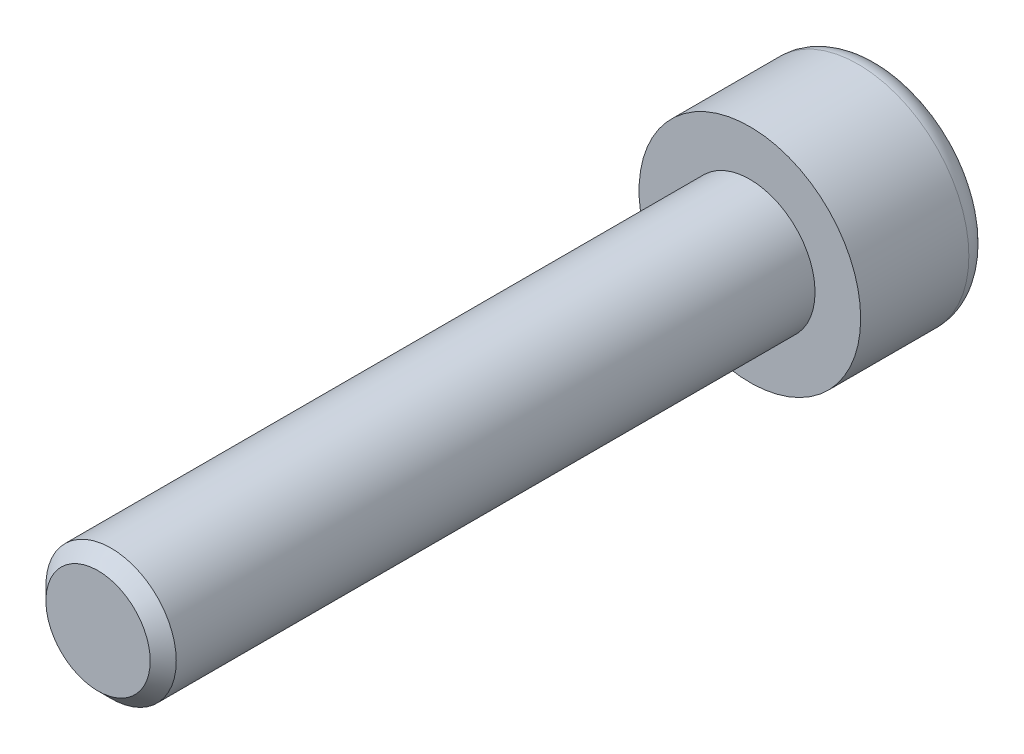
ISO-10303-21;
HEADER;
FILE_DESCRIPTION(('STEP AP214'),'2;1');
FILE_NAME('part.step','',(''),(''),'','','');
FILE_SCHEMA(('AUTOMOTIVE_DESIGN { 1 0 10303 214 1 1 1 1 }'));
ENDSEC;
DATA;
#1=APPLICATION_CONTEXT('core data for automotive mechanical design processes');
#2=APPLICATION_PROTOCOL_DEFINITION('international standard','automotive_design',2000,#1);
#3=PRODUCT_CONTEXT('',#1,'mechanical');
#4=PRODUCT('Part','Part','',(#3));
#5=PRODUCT_RELATED_PRODUCT_CATEGORY('part','',(#4));
#6=PRODUCT_DEFINITION_FORMATION('','',#4);
#7=PRODUCT_DEFINITION_CONTEXT('part definition',#1,'design');
#8=PRODUCT_DEFINITION('design','',#6,#7);
#9=PRODUCT_DEFINITION_SHAPE('','',#8);
#10=(LENGTH_UNIT() NAMED_UNIT(*) SI_UNIT(.MILLI.,.METRE.));
#11=(NAMED_UNIT(*) PLANE_ANGLE_UNIT() SI_UNIT($,.RADIAN.));
#12=(NAMED_UNIT(*) SI_UNIT($,.STERADIAN.) SOLID_ANGLE_UNIT());
#13=UNCERTAINTY_MEASURE_WITH_UNIT(LENGTH_MEASURE(1.E-05),#10,'distance_accuracy_value','');
#14=(GEOMETRIC_REPRESENTATION_CONTEXT(3) GLOBAL_UNCERTAINTY_ASSIGNED_CONTEXT((#13)) GLOBAL_UNIT_ASSIGNED_CONTEXT((#10,
#11,#12)) REPRESENTATION_CONTEXT('',''));
#15=CARTESIAN_POINT('',(0.,0.,0.));
#16=DIRECTION('',(0.,0.,1.));
#17=DIRECTION('',(1.,0.,0.));
#18=AXIS2_PLACEMENT_3D('',#15,#16,#17);
#19=CARTESIAN_POINT('',(0.,0.,25.));
#20=DIRECTION('',(0.,0.,-1.));
#21=DIRECTION('',(1.,0.,0.));
#22=AXIS2_PLACEMENT_3D('',#19,#20,#21);
#23=PLANE('',#22);
#24=CARTESIAN_POINT('',(0.,0.,25.));
#25=DIRECTION('',(0.,0.,1.));
#26=DIRECTION('',(1.,0.,0.));
#27=AXIS2_PLACEMENT_3D('',#24,#25,#26);
#28=CIRCLE('',#27,2.);
#29=CARTESIAN_POINT('',(2.,0.,25.));
#30=VERTEX_POINT('',#29);
#31=EDGE_CURVE('E11',#30,#30,#28,.T.);
#32=ORIENTED_EDGE('',*,*,#31,.T.);
#33=EDGE_LOOP('',(#32));
#34=FACE_BOUND('',#33,.T.);
#35=ADVANCED_FACE('F41',(#34),#23,.F.);
#36=CARTESIAN_POINT('',(0.,0.,25.));
#37=DIRECTION('',(0.,0.,-1.));
#38=DIRECTION('',(1.,0.,0.));
#39=AXIS2_PLACEMENT_3D('',#36,#37,#38);
#40=CONICAL_SURFACE('',#39,2.,0.785398163404999);
#41=ORIENTED_EDGE('',*,*,#31,.F.);
#42=DIRECTION('',(0.707106781192048,0.,-0.707106781181048));
#43=VECTOR('',#42,1.);
#44=CARTESIAN_POINT('',(2.,0.,25.));
#45=LINE('',#44,#43);
#46=CARTESIAN_POINT('',(2.5,0.,24.5));
#47=VERTEX_POINT('',#46);
#48=EDGE_CURVE('E52',#30,#47,#45,.T.);
#49=ORIENTED_EDGE('',*,*,#48,.T.);
#50=CARTESIAN_POINT('',(0.,0.,24.5));
#51=DIRECTION('',(0.,0.,1.));
#52=DIRECTION('',(1.,0.,0.));
#53=AXIS2_PLACEMENT_3D('',#50,#51,#52);
#54=CIRCLE('',#53,2.5);
#55=EDGE_CURVE('E211',#47,#47,#54,.T.);
#56=ORIENTED_EDGE('',*,*,#55,.T.);
#57=ORIENTED_EDGE('',*,*,#48,.F.);
#58=EDGE_LOOP('',(#41,#49,#56,#57));
#59=FACE_BOUND('',#58,.T.);
#60=ADVANCED_FACE('F257',(#59),#40,.T.);
#61=CARTESIAN_POINT('',(0.,0.,24.5));
#62=DIRECTION('',(0.,0.,-1.));
#63=DIRECTION('',(1.,0.,0.));
#64=AXIS2_PLACEMENT_3D('',#61,#62,#63);
#65=CYLINDRICAL_SURFACE('',#64,2.5);
#66=ORIENTED_EDGE('',*,*,#55,.F.);
#67=DIRECTION('',(0.,0.,-1.));
#68=VECTOR('',#67,1.);
#69=CARTESIAN_POINT('',(2.5,0.,24.5));
#70=LINE('',#69,#68);
#71=CARTESIAN_POINT('',(2.5,0.,0.));
#72=VERTEX_POINT('',#71);
#73=EDGE_CURVE('E301',#47,#72,#70,.T.);
#74=ORIENTED_EDGE('',*,*,#73,.T.);
#75=CARTESIAN_POINT('',(0.,0.,0.));
#76=DIRECTION('',(0.,0.,1.));
#77=DIRECTION('',(1.,0.,0.));
#78=AXIS2_PLACEMENT_3D('',#75,#76,#77);
#79=CIRCLE('',#78,2.5);
#80=EDGE_CURVE('E184',#72,#72,#79,.T.);
#81=ORIENTED_EDGE('',*,*,#80,.T.);
#82=ORIENTED_EDGE('',*,*,#73,.F.);
#83=EDGE_LOOP('',(#66,#74,#81,#82));
#84=FACE_BOUND('',#83,.T.);
#85=ADVANCED_FACE('F249',(#84),#65,.T.);
#86=CARTESIAN_POINT('',(0.,0.,0.));
#87=DIRECTION('',(0.,0.,-1.));
#88=DIRECTION('',(1.,0.,0.));
#89=AXIS2_PLACEMENT_3D('',#86,#87,#88);
#90=PLANE('',#89);
#91=ORIENTED_EDGE('',*,*,#80,.F.);
#92=EDGE_LOOP('',(#91));
#93=FACE_BOUND('',#92,.T.);
#94=CARTESIAN_POINT('',(0.,0.,0.));
#95=DIRECTION('',(0.,0.,1.));
#96=DIRECTION('',(1.,0.,0.));
#97=AXIS2_PLACEMENT_3D('',#94,#95,#96);
#98=CIRCLE('',#97,4.25);
#99=CARTESIAN_POINT('',(4.25,0.,0.));
#100=VERTEX_POINT('',#99);
#101=EDGE_CURVE('E180',#100,#100,#98,.T.);
#102=ORIENTED_EDGE('',*,*,#101,.T.);
#103=EDGE_LOOP('',(#102));
#104=FACE_BOUND('',#103,.T.);
#105=ADVANCED_FACE('F247',(#93,#104),#90,.F.);
#106=CARTESIAN_POINT('',(0.,0.,0.));
#107=DIRECTION('',(0.,0.,-1.));
#108=DIRECTION('',(1.,0.,0.));
#109=AXIS2_PLACEMENT_3D('',#106,#107,#108);
#110=CYLINDRICAL_SURFACE('',#109,4.25);
#111=ORIENTED_EDGE('',*,*,#101,.F.);
#112=DIRECTION('',(0.,0.,-1.));
#113=VECTOR('',#112,1.);
#114=CARTESIAN_POINT('',(4.25,0.,0.));
#115=LINE('',#114,#113);
#116=CARTESIAN_POINT('',(4.25,0.,-4.15));
#117=VERTEX_POINT('',#116);
#118=EDGE_CURVE('E185',#100,#117,#115,.T.);
#119=ORIENTED_EDGE('',*,*,#118,.T.);
#120=CARTESIAN_POINT('',(0.,0.,-4.15));
#121=DIRECTION('',(0.,0.,1.));
#122=DIRECTION('',(1.,0.,0.));
#123=AXIS2_PLACEMENT_3D('',#120,#121,#122);
#124=CIRCLE('',#123,4.25);
#125=EDGE_CURVE('E217',#117,#117,#124,.T.);
#126=ORIENTED_EDGE('',*,*,#125,.T.);
#127=ORIENTED_EDGE('',*,*,#118,.F.);
#128=EDGE_LOOP('',(#111,#119,#126,#127));
#129=FACE_BOUND('',#128,.T.);
#130=ADVANCED_FACE('F243',(#129),#110,.T.);
#131=CARTESIAN_POINT('',(0.,0.,-4.15));
#132=DIRECTION('',(0.,0.,-1.));
#133=DIRECTION('',(1.,0.,0.));
#134=AXIS2_PLACEMENT_3D('',#131,#132,#133);
#135=TOROIDAL_SURFACE('',#134,3.4,0.85);
#136=ORIENTED_EDGE('',*,*,#125,.F.);
#137=CARTESIAN_POINT('',(3.4,0.,-4.15));
#138=DIRECTION('',(0.,1.,0.));
#139=DIRECTION('',(1.,0.,0.));
#140=AXIS2_PLACEMENT_3D('',#137,#138,#139);
#141=CIRCLE('',#140,0.85);
#142=CARTESIAN_POINT('',(3.4,0.,-5.));
#143=VERTEX_POINT('',#142);
#144=EDGE_CURVE('E170',#117,#143,#141,.T.);
#145=ORIENTED_EDGE('',*,*,#144,.T.);
#146=CARTESIAN_POINT('',(0.,0.,-5.));
#147=DIRECTION('',(0.,0.,1.));
#148=DIRECTION('',(1.,0.,0.));
#149=AXIS2_PLACEMENT_3D('',#146,#147,#148);
#150=CIRCLE('',#149,3.4);
#151=EDGE_CURVE('E224',#143,#143,#150,.T.);
#152=ORIENTED_EDGE('',*,*,#151,.T.);
#153=ORIENTED_EDGE('',*,*,#144,.F.);
#154=EDGE_LOOP('',(#136,#145,#152,#153));
#155=FACE_BOUND('',#154,.T.);
#156=ADVANCED_FACE('F238',(#155),#135,.T.);
#157=CARTESIAN_POINT('',(0.,0.,-5.));
#158=DIRECTION('',(0.,0.,-1.));
#159=DIRECTION('',(1.,0.,0.));
#160=AXIS2_PLACEMENT_3D('',#157,#158,#159);
#161=PLANE('',#160);
#162=ORIENTED_EDGE('',*,*,#151,.F.);
#163=EDGE_LOOP('',(#162));
#164=FACE_BOUND('',#163,.T.);
#165=DIRECTION('',(1.,0.,0.));
#166=VECTOR('',#165,1.);
#167=CARTESIAN_POINT('',(-1.155,-2.000518682742,-5.));
#168=LINE('',#167,#166);
#169=CARTESIAN_POINT('',(-1.155,-2.000518682742,-5.));
#170=VERTEX_POINT('',#169);
#171=CARTESIAN_POINT('',(1.155,-2.000518682742,-5.));
#172=VERTEX_POINT('',#171);
#173=EDGE_CURVE('E173',#170,#172,#168,.T.);
#174=ORIENTED_EDGE('',*,*,#173,.T.);
#175=DIRECTION('',(0.50000000000019,0.866025403784329,0.));
#176=VECTOR('',#175,1.);
#177=CARTESIAN_POINT('',(1.155,-2.000518682742,-5.));
#178=LINE('',#177,#176);
#179=CARTESIAN_POINT('',(2.31,0.,-5.));
#180=VERTEX_POINT('',#179);
#181=EDGE_CURVE('E194',#172,#180,#178,.T.);
#182=ORIENTED_EDGE('',*,*,#181,.T.);
#183=DIRECTION('',(-0.50000000000019,0.866025403784329,0.));
#184=VECTOR('',#183,1.);
#185=CARTESIAN_POINT('',(2.31,0.,-5.));
#186=LINE('',#185,#184);
#187=CARTESIAN_POINT('',(1.155,2.000518682742,-5.));
#188=VERTEX_POINT('',#187);
#189=EDGE_CURVE('E186',#180,#188,#186,.T.);
#190=ORIENTED_EDGE('',*,*,#189,.T.);
#191=DIRECTION('',(-1.,0.,0.));
#192=VECTOR('',#191,1.);
#193=CARTESIAN_POINT('',(1.155,2.000518682742,-5.));
#194=LINE('',#193,#192);
#195=CARTESIAN_POINT('',(-1.155,2.000518682742,-5.));
#196=VERTEX_POINT('',#195);
#197=EDGE_CURVE('E176',#188,#196,#194,.T.);
#198=ORIENTED_EDGE('',*,*,#197,.T.);
#199=DIRECTION('',(-0.50000000000019,-0.866025403784329,0.));
#200=VECTOR('',#199,1.);
#201=CARTESIAN_POINT('',(-1.155,2.000518682742,-5.));
#202=LINE('',#201,#200);
#203=CARTESIAN_POINT('',(-2.31,0.,-5.));
#204=VERTEX_POINT('',#203);
#205=EDGE_CURVE('E154',#196,#204,#202,.T.);
#206=ORIENTED_EDGE('',*,*,#205,.T.);
#207=DIRECTION('',(0.50000000000019,-0.866025403784329,0.));
#208=VECTOR('',#207,1.);
#209=CARTESIAN_POINT('',(-2.31,0.,-5.));
#210=LINE('',#209,#208);
#211=EDGE_CURVE('E157',#204,#170,#210,.T.);
#212=ORIENTED_EDGE('',*,*,#211,.T.);
#213=EDGE_LOOP('',(#174,#182,#190,#198,#206,#212));
#214=FACE_BOUND('',#213,.T.);
#215=ADVANCED_FACE('F314',(#164,#214),#161,.T.);
#216=CARTESIAN_POINT('',(1.155,-2.000518682742,-2.5));
#217=DIRECTION('',(-0.866025403784329,0.50000000000019,0.));
#218=DIRECTION('',(0.,0.,-1.));
#219=AXIS2_PLACEMENT_3D('',#216,#217,#218);
#220=PLANE('',#219);
#221=DIRECTION('',(0.,0.,-1.));
#222=VECTOR('',#221,1.);
#223=CARTESIAN_POINT('',(1.155,-2.000518682742,-2.5));
#224=LINE('',#223,#222);
#225=CARTESIAN_POINT('',(1.155,-2.000518682742,-2.5));
#226=VERTEX_POINT('',#225);
#227=EDGE_CURVE('E201',#226,#172,#224,.T.);
#228=ORIENTED_EDGE('',*,*,#227,.F.);
#229=DIRECTION('',(0.50000000000019,0.866025403784329,0.));
#230=VECTOR('',#229,1.);
#231=CARTESIAN_POINT('',(1.155,-2.000518682742,-2.5));
#232=LINE('',#231,#230);
#233=CARTESIAN_POINT('',(2.31,0.,-2.5));
#234=VERTEX_POINT('',#233);
#235=EDGE_CURVE('E218',#226,#234,#232,.T.);
#236=ORIENTED_EDGE('',*,*,#235,.T.);
#237=DIRECTION('',(0.,0.,-1.));
#238=VECTOR('',#237,1.);
#239=CARTESIAN_POINT('',(2.31,0.,-2.5));
#240=LINE('',#239,#238);
#241=EDGE_CURVE('E179',#234,#180,#240,.T.);
#242=ORIENTED_EDGE('',*,*,#241,.T.);
#243=ORIENTED_EDGE('',*,*,#181,.F.);
#244=EDGE_LOOP('',(#228,#236,#242,#243));
#245=FACE_BOUND('',#244,.T.);
#246=ADVANCED_FACE('F43',(#245),#220,.T.);
#247=CARTESIAN_POINT('',(-1.155,-2.000518682742,-2.5));
#248=DIRECTION('',(0.,1.,0.));
#249=DIRECTION('',(1.,0.,0.));
#250=AXIS2_PLACEMENT_3D('',#247,#248,#249);
#251=PLANE('',#250);
#252=DIRECTION('',(0.,0.,-1.));
#253=VECTOR('',#252,1.);
#254=CARTESIAN_POINT('',(-1.155,-2.000518682742,-2.5));
#255=LINE('',#254,#253);
#256=CARTESIAN_POINT('',(-1.155,-2.000518682742,-2.5));
#257=VERTEX_POINT('',#256);
#258=EDGE_CURVE('E191',#257,#170,#255,.T.);
#259=ORIENTED_EDGE('',*,*,#258,.F.);
#260=DIRECTION('',(1.,0.,0.));
#261=VECTOR('',#260,1.);
#262=CARTESIAN_POINT('',(-1.155,-2.000518682742,-2.5));
#263=LINE('',#262,#261);
#264=EDGE_CURVE('E45',#257,#226,#263,.T.);
#265=ORIENTED_EDGE('',*,*,#264,.T.);
#266=ORIENTED_EDGE('',*,*,#227,.T.);
#267=ORIENTED_EDGE('',*,*,#173,.F.);
#268=EDGE_LOOP('',(#259,#265,#266,#267));
#269=FACE_BOUND('',#268,.T.);
#270=ADVANCED_FACE('F276',(#269),#251,.T.);
#271=CARTESIAN_POINT('',(-2.31,0.,-2.5));
#272=DIRECTION('',(0.866025403784329,0.50000000000019,0.));
#273=DIRECTION('',(0.,0.,1.));
#274=AXIS2_PLACEMENT_3D('',#271,#272,#273);
#275=PLANE('',#274);
#276=DIRECTION('',(0.,0.,-1.));
#277=VECTOR('',#276,1.);
#278=CARTESIAN_POINT('',(-2.31,0.,-2.5));
#279=LINE('',#278,#277);
#280=CARTESIAN_POINT('',(-2.31,0.,-2.5));
#281=VERTEX_POINT('',#280);
#282=EDGE_CURVE('E164',#281,#204,#279,.T.);
#283=ORIENTED_EDGE('',*,*,#282,.F.);
#284=DIRECTION('',(0.50000000000019,-0.866025403784329,0.));
#285=VECTOR('',#284,1.);
#286=CARTESIAN_POINT('',(-2.31,0.,-2.5));
#287=LINE('',#286,#285);
#288=EDGE_CURVE('E146',#281,#257,#287,.T.);
#289=ORIENTED_EDGE('',*,*,#288,.T.);
#290=ORIENTED_EDGE('',*,*,#258,.T.);
#291=ORIENTED_EDGE('',*,*,#211,.F.);
#292=EDGE_LOOP('',(#283,#289,#290,#291));
#293=FACE_BOUND('',#292,.T.);
#294=ADVANCED_FACE('F275',(#293),#275,.T.);
#295=CARTESIAN_POINT('',(-1.155,2.000518682742,-2.5));
#296=DIRECTION('',(0.866025403784329,-0.50000000000019,0.));
#297=DIRECTION('',(0.,0.,1.));
#298=AXIS2_PLACEMENT_3D('',#295,#296,#297);
#299=PLANE('',#298);
#300=DIRECTION('',(0.,0.,-1.));
#301=VECTOR('',#300,1.);
#302=CARTESIAN_POINT('',(-1.155,2.000518682742,-2.5));
#303=LINE('',#302,#301);
#304=CARTESIAN_POINT('',(-1.155,2.000518682742,-2.5));
#305=VERTEX_POINT('',#304);
#306=EDGE_CURVE('E138',#305,#196,#303,.T.);
#307=ORIENTED_EDGE('',*,*,#306,.F.);
#308=DIRECTION('',(-0.50000000000019,-0.866025403784329,0.));
#309=VECTOR('',#308,1.);
#310=CARTESIAN_POINT('',(-1.155,2.000518682742,-2.5));
#311=LINE('',#310,#309);
#312=EDGE_CURVE('E142',#305,#281,#311,.T.);
#313=ORIENTED_EDGE('',*,*,#312,.T.);
#314=ORIENTED_EDGE('',*,*,#282,.T.);
#315=ORIENTED_EDGE('',*,*,#205,.F.);
#316=EDGE_LOOP('',(#307,#313,#314,#315));
#317=FACE_BOUND('',#316,.T.);
#318=ADVANCED_FACE('F152',(#317),#299,.T.);
#319=CARTESIAN_POINT('',(1.155,2.000518682742,-2.5));
#320=DIRECTION('',(0.,-1.,0.));
#321=DIRECTION('',(-1.,0.,0.));
#322=AXIS2_PLACEMENT_3D('',#319,#320,#321);
#323=PLANE('',#322);
#324=DIRECTION('',(0.,0.,-1.));
#325=VECTOR('',#324,1.);
#326=CARTESIAN_POINT('',(1.155,2.000518682742,-2.5));
#327=LINE('',#326,#325);
#328=CARTESIAN_POINT('',(1.155,2.000518682742,-2.5));
#329=VERTEX_POINT('',#328);
#330=EDGE_CURVE('E140',#329,#188,#327,.T.);
#331=ORIENTED_EDGE('',*,*,#330,.F.);
#332=DIRECTION('',(-1.,0.,0.));
#333=VECTOR('',#332,1.);
#334=CARTESIAN_POINT('',(1.155,2.000518682742,-2.5));
#335=LINE('',#334,#333);
#336=EDGE_CURVE('E133',#329,#305,#335,.T.);
#337=ORIENTED_EDGE('',*,*,#336,.T.);
#338=ORIENTED_EDGE('',*,*,#306,.T.);
#339=ORIENTED_EDGE('',*,*,#197,.F.);
#340=EDGE_LOOP('',(#331,#337,#338,#339));
#341=FACE_BOUND('',#340,.T.);
#342=ADVANCED_FACE('F135',(#341),#323,.T.);
#343=CARTESIAN_POINT('',(2.31,0.,-2.5));
#344=DIRECTION('',(-0.866025403784329,-0.50000000000019,0.));
#345=DIRECTION('',(-0.50000000000019,0.866025403784329,0.));
#346=AXIS2_PLACEMENT_3D('',#343,#344,#345);
#347=PLANE('',#346);
#348=ORIENTED_EDGE('',*,*,#241,.F.);
#349=DIRECTION('',(-0.50000000000019,0.866025403784329,0.));
#350=VECTOR('',#349,1.);
#351=CARTESIAN_POINT('',(2.31,0.,-2.5));
#352=LINE('',#351,#350);
#353=EDGE_CURVE('E99',#234,#329,#352,.T.);
#354=ORIENTED_EDGE('',*,*,#353,.T.);
#355=ORIENTED_EDGE('',*,*,#330,.T.);
#356=ORIENTED_EDGE('',*,*,#189,.F.);
#357=EDGE_LOOP('',(#348,#354,#355,#356));
#358=FACE_BOUND('',#357,.T.);
#359=ADVANCED_FACE('F279',(#358),#347,.T.);
#360=CARTESIAN_POINT('',(0.,0.,-2.5));
#361=DIRECTION('',(0.,0.,-1.));
#362=DIRECTION('',(1.,0.,0.));
#363=AXIS2_PLACEMENT_3D('',#360,#361,#362);
#364=PLANE('',#363);
#365=ORIENTED_EDGE('',*,*,#353,.F.);
#366=ORIENTED_EDGE('',*,*,#235,.F.);
#367=ORIENTED_EDGE('',*,*,#264,.F.);
#368=ORIENTED_EDGE('',*,*,#288,.F.);
#369=ORIENTED_EDGE('',*,*,#312,.F.);
#370=ORIENTED_EDGE('',*,*,#336,.F.);
#371=EDGE_LOOP('',(#365,#366,#367,#368,#369,#370));
#372=FACE_BOUND('',#371,.T.);
#373=ADVANCED_FACE('F145',(#372),#364,.T.);
#374=CLOSED_SHELL('',(#35,#60,#85,#105,#130,#156,#215,#246,#270,#294,#318,#342,#359,#373));
#375=MANIFOLD_SOLID_BREP('B2',#374);
#376=ADVANCED_BREP_SHAPE_REPRESENTATION('',(#18,#375),#14);
#377=SHAPE_DEFINITION_REPRESENTATION(#9,#376);
ENDSEC;
END-ISO-10303-21;
